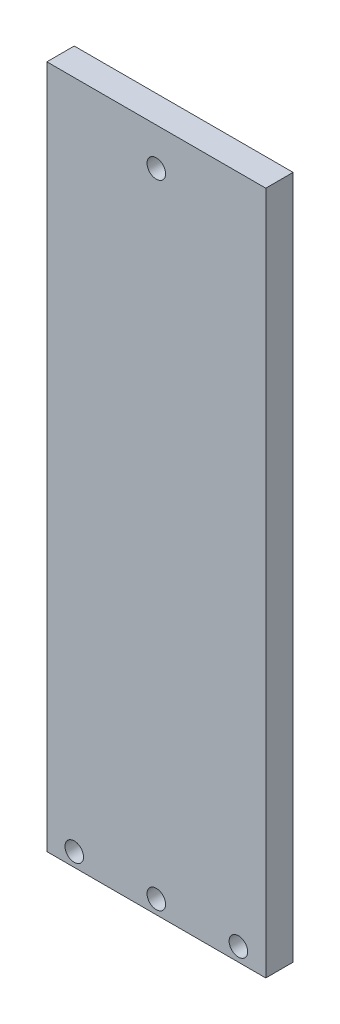
ISO-10303-21;
HEADER;
FILE_DESCRIPTION(('STEP AP214'),'2;1');
FILE_NAME('part.step','',(''),(''),'','','');
FILE_SCHEMA(('AUTOMOTIVE_DESIGN { 1 0 10303 214 1 1 1 1 }'));
ENDSEC;
DATA;
#1=APPLICATION_CONTEXT('core data for automotive mechanical design processes');
#2=APPLICATION_PROTOCOL_DEFINITION('international standard','automotive_design',2000,#1);
#3=PRODUCT_CONTEXT('',#1,'mechanical');
#4=PRODUCT('Part','Part','',(#3));
#5=PRODUCT_RELATED_PRODUCT_CATEGORY('part','',(#4));
#6=PRODUCT_DEFINITION_FORMATION('','',#4);
#7=PRODUCT_DEFINITION_CONTEXT('part definition',#1,'design');
#8=PRODUCT_DEFINITION('design','',#6,#7);
#9=PRODUCT_DEFINITION_SHAPE('','',#8);
#10=(LENGTH_UNIT() NAMED_UNIT(*) SI_UNIT(.MILLI.,.METRE.));
#11=(NAMED_UNIT(*) PLANE_ANGLE_UNIT() SI_UNIT($,.RADIAN.));
#12=(NAMED_UNIT(*) SI_UNIT($,.STERADIAN.) SOLID_ANGLE_UNIT());
#13=UNCERTAINTY_MEASURE_WITH_UNIT(LENGTH_MEASURE(1.E-05),#10,'distance_accuracy_value','');
#14=(GEOMETRIC_REPRESENTATION_CONTEXT(3) GLOBAL_UNCERTAINTY_ASSIGNED_CONTEXT((#13)) GLOBAL_UNIT_ASSIGNED_CONTEXT((#10,
#11,#12)) REPRESENTATION_CONTEXT('',''));
#15=CARTESIAN_POINT('',(0.,0.,0.));
#16=DIRECTION('',(0.,0.,1.));
#17=DIRECTION('',(1.,0.,0.));
#18=AXIS2_PLACEMENT_3D('',#15,#16,#17);
#19=CARTESIAN_POINT('',(0.,0.,3.175));
#20=DIRECTION('',(0.,0.,-1.));
#21=DIRECTION('',(-1.,0.,0.));
#22=AXIS2_PLACEMENT_3D('',#19,#20,#21);
#23=PLANE('',#22);
#24=DIRECTION('',(0.,1.,0.));
#25=VECTOR('',#24,1.);
#26=CARTESIAN_POINT('',(25.4,-76.2,3.175));
#27=LINE('',#26,#25);
#28=CARTESIAN_POINT('',(25.4,-82.55,3.175));
#29=VERTEX_POINT('',#28);
#30=CARTESIAN_POINT('',(25.4,76.2,3.175));
#31=VERTEX_POINT('',#30);
#32=EDGE_CURVE('E51',#29,#31,#27,.T.);
#33=ORIENTED_EDGE('',*,*,#32,.T.);
#34=DIRECTION('',(-1.,0.,0.));
#35=VECTOR('',#34,1.);
#36=CARTESIAN_POINT('',(-25.4,76.2,3.175));
#37=LINE('',#36,#35);
#38=CARTESIAN_POINT('',(-25.4,76.2,3.175));
#39=VERTEX_POINT('',#38);
#40=EDGE_CURVE('E81',#31,#39,#37,.T.);
#41=ORIENTED_EDGE('',*,*,#40,.T.);
#42=DIRECTION('',(0.,-1.,0.));
#43=VECTOR('',#42,1.);
#44=CARTESIAN_POINT('',(-25.4,-76.2,3.175));
#45=LINE('',#44,#43);
#46=CARTESIAN_POINT('',(-25.4,-82.55,3.175));
#47=VERTEX_POINT('',#46);
#48=EDGE_CURVE('E85',#39,#47,#45,.T.);
#49=ORIENTED_EDGE('',*,*,#48,.T.);
#50=DIRECTION('',(1.,0.,0.));
#51=VECTOR('',#50,1.);
#52=CARTESIAN_POINT('',(-25.4,-82.55,3.175));
#53=LINE('',#52,#51);
#54=EDGE_CURVE('E93',#47,#29,#53,.T.);
#55=ORIENTED_EDGE('',*,*,#54,.T.);
#56=EDGE_LOOP('',(#33,#41,#49,#55));
#57=FACE_BOUND('',#56,.T.);
#58=CARTESIAN_POINT('',(0.,67.4497,3.175));
#59=DIRECTION('',(0.,0.,1.));
#60=DIRECTION('',(1.,0.,0.));
#61=AXIS2_PLACEMENT_3D('',#58,#59,#60);
#62=CIRCLE('',#61,2.15265);
#63=CARTESIAN_POINT('',(2.15265,67.4497,3.175));
#64=VERTEX_POINT('',#63);
#65=EDGE_CURVE('E100',#64,#64,#62,.T.);
#66=ORIENTED_EDGE('',*,*,#65,.F.);
#67=EDGE_LOOP('',(#66));
#68=FACE_BOUND('',#67,.T.);
#69=CARTESIAN_POINT('',(-19.05,-79.375,3.175));
#70=DIRECTION('',(0.,0.,1.));
#71=DIRECTION('',(1.,0.,0.));
#72=AXIS2_PLACEMENT_3D('',#69,#70,#71);
#73=CIRCLE('',#72,2.15265);
#74=CARTESIAN_POINT('',(-16.89735,-79.375,3.175));
#75=VERTEX_POINT('',#74);
#76=EDGE_CURVE('E161',#75,#75,#73,.T.);
#77=ORIENTED_EDGE('',*,*,#76,.F.);
#78=EDGE_LOOP('',(#77));
#79=FACE_BOUND('',#78,.T.);
#80=CARTESIAN_POINT('',(0.,-79.375,3.175));
#81=DIRECTION('',(0.,0.,1.));
#82=DIRECTION('',(1.,0.,0.));
#83=AXIS2_PLACEMENT_3D('',#80,#81,#82);
#84=CIRCLE('',#83,2.15265);
#85=CARTESIAN_POINT('',(2.15265,-79.375,3.175));
#86=VERTEX_POINT('',#85);
#87=EDGE_CURVE('E155',#86,#86,#84,.T.);
#88=ORIENTED_EDGE('',*,*,#87,.F.);
#89=EDGE_LOOP('',(#88));
#90=FACE_BOUND('',#89,.T.);
#91=CARTESIAN_POINT('',(19.05,-79.375,3.175));
#92=DIRECTION('',(0.,0.,1.));
#93=DIRECTION('',(1.,0.,0.));
#94=AXIS2_PLACEMENT_3D('',#91,#92,#93);
#95=CIRCLE('',#94,2.15265);
#96=CARTESIAN_POINT('',(21.20265,-79.375,3.175));
#97=VERTEX_POINT('',#96);
#98=EDGE_CURVE('E146',#97,#97,#95,.T.);
#99=ORIENTED_EDGE('',*,*,#98,.F.);
#100=EDGE_LOOP('',(#99));
#101=FACE_BOUND('',#100,.T.);
#102=ADVANCED_FACE('F34',(#57,#68,#79,#90,#101),#23,.F.);
#103=CARTESIAN_POINT('',(0.,0.,-3.175));
#104=DIRECTION('',(0.,0.,-1.));
#105=DIRECTION('',(-1.,0.,0.));
#106=AXIS2_PLACEMENT_3D('',#103,#104,#105);
#107=PLANE('',#106);
#108=CARTESIAN_POINT('',(0.,-79.375,-3.175));
#109=DIRECTION('',(0.,0.,1.));
#110=DIRECTION('',(1.,0.,0.));
#111=AXIS2_PLACEMENT_3D('',#108,#109,#110);
#112=CIRCLE('',#111,2.15265);
#113=CARTESIAN_POINT('',(2.15265,-79.375,-3.175));
#114=VERTEX_POINT('',#113);
#115=EDGE_CURVE('E152',#114,#114,#112,.T.);
#116=ORIENTED_EDGE('',*,*,#115,.T.);
#117=EDGE_LOOP('',(#116));
#118=FACE_BOUND('',#117,.T.);
#119=CARTESIAN_POINT('',(0.,67.4497,-3.175));
#120=DIRECTION('',(0.,0.,1.));
#121=DIRECTION('',(1.,0.,0.));
#122=AXIS2_PLACEMENT_3D('',#119,#120,#121);
#123=CIRCLE('',#122,2.15265);
#124=CARTESIAN_POINT('',(2.15265,67.4497,-3.175));
#125=VERTEX_POINT('',#124);
#126=EDGE_CURVE('E164',#125,#125,#123,.T.);
#127=ORIENTED_EDGE('',*,*,#126,.T.);
#128=EDGE_LOOP('',(#127));
#129=FACE_BOUND('',#128,.T.);
#130=DIRECTION('',(-1.,0.,0.));
#131=VECTOR('',#130,1.);
#132=CARTESIAN_POINT('',(-25.4,76.2,-3.175));
#133=LINE('',#132,#131);
#134=CARTESIAN_POINT('',(25.4,76.2,-3.175));
#135=VERTEX_POINT('',#134);
#136=CARTESIAN_POINT('',(-25.4,76.2,-3.175));
#137=VERTEX_POINT('',#136);
#138=EDGE_CURVE('E89',#135,#137,#133,.T.);
#139=ORIENTED_EDGE('',*,*,#138,.F.);
#140=DIRECTION('',(0.,1.,0.));
#141=VECTOR('',#140,1.);
#142=CARTESIAN_POINT('',(25.4,-82.55,-3.175));
#143=LINE('',#142,#141);
#144=CARTESIAN_POINT('',(25.4,-82.55,-3.175));
#145=VERTEX_POINT('',#144);
#146=EDGE_CURVE('E103',#145,#135,#143,.T.);
#147=ORIENTED_EDGE('',*,*,#146,.F.);
#148=DIRECTION('',(1.,0.,0.));
#149=VECTOR('',#148,1.);
#150=CARTESIAN_POINT('',(-25.4,-82.55,-3.175));
#151=LINE('',#150,#149);
#152=CARTESIAN_POINT('',(-25.4,-82.55,-3.175));
#153=VERTEX_POINT('',#152);
#154=EDGE_CURVE('E75',#153,#145,#151,.T.);
#155=ORIENTED_EDGE('',*,*,#154,.F.);
#156=DIRECTION('',(0.,-1.,0.));
#157=VECTOR('',#156,1.);
#158=CARTESIAN_POINT('',(-25.4,-76.2,-3.175));
#159=LINE('',#158,#157);
#160=EDGE_CURVE('E68',#137,#153,#159,.T.);
#161=ORIENTED_EDGE('',*,*,#160,.F.);
#162=EDGE_LOOP('',(#139,#147,#155,#161));
#163=FACE_BOUND('',#162,.T.);
#164=CARTESIAN_POINT('',(-19.05,-79.375,-3.175));
#165=DIRECTION('',(0.,0.,1.));
#166=DIRECTION('',(1.,0.,0.));
#167=AXIS2_PLACEMENT_3D('',#164,#165,#166);
#168=CIRCLE('',#167,2.15265);
#169=CARTESIAN_POINT('',(-16.89735,-79.375,-3.175));
#170=VERTEX_POINT('',#169);
#171=EDGE_CURVE('E158',#170,#170,#168,.T.);
#172=ORIENTED_EDGE('',*,*,#171,.T.);
#173=EDGE_LOOP('',(#172));
#174=FACE_BOUND('',#173,.T.);
#175=CARTESIAN_POINT('',(19.05,-79.375,-3.175));
#176=DIRECTION('',(0.,0.,1.));
#177=DIRECTION('',(1.,0.,0.));
#178=AXIS2_PLACEMENT_3D('',#175,#176,#177);
#179=CIRCLE('',#178,2.15265);
#180=CARTESIAN_POINT('',(21.20265,-79.375,-3.175));
#181=VERTEX_POINT('',#180);
#182=EDGE_CURVE('E149',#181,#181,#179,.T.);
#183=ORIENTED_EDGE('',*,*,#182,.T.);
#184=EDGE_LOOP('',(#183));
#185=FACE_BOUND('',#184,.T.);
#186=ADVANCED_FACE('F109',(#118,#129,#163,#174,#185),#107,.T.);
#187=CARTESIAN_POINT('',(-25.4,76.2,3.175));
#188=DIRECTION('',(0.,-1.,0.));
#189=DIRECTION('',(0.,0.,-1.));
#190=AXIS2_PLACEMENT_3D('',#187,#188,#189);
#191=PLANE('',#190);
#192=ORIENTED_EDGE('',*,*,#138,.T.);
#193=DIRECTION('',(0.,0.,-1.));
#194=VECTOR('',#193,1.);
#195=CARTESIAN_POINT('',(-25.4,76.2,3.175));
#196=LINE('',#195,#194);
#197=EDGE_CURVE('E43',#39,#137,#196,.T.);
#198=ORIENTED_EDGE('',*,*,#197,.F.);
#199=ORIENTED_EDGE('',*,*,#40,.F.);
#200=DIRECTION('',(0.,0.,-1.));
#201=VECTOR('',#200,1.);
#202=CARTESIAN_POINT('',(25.4,76.2,3.175));
#203=LINE('',#202,#201);
#204=EDGE_CURVE('E11',#31,#135,#203,.T.);
#205=ORIENTED_EDGE('',*,*,#204,.T.);
#206=EDGE_LOOP('',(#192,#198,#199,#205));
#207=FACE_BOUND('',#206,.T.);
#208=ADVANCED_FACE('F36',(#207),#191,.F.);
#209=CARTESIAN_POINT('',(-25.4,-76.2,3.175));
#210=DIRECTION('',(1.,0.,0.));
#211=DIRECTION('',(0.,0.,-1.));
#212=AXIS2_PLACEMENT_3D('',#209,#210,#211);
#213=PLANE('',#212);
#214=ORIENTED_EDGE('',*,*,#160,.T.);
#215=DIRECTION('',(0.,0.,-1.));
#216=VECTOR('',#215,1.);
#217=CARTESIAN_POINT('',(-25.4,-82.55,3.175));
#218=LINE('',#217,#216);
#219=EDGE_CURVE('E90',#47,#153,#218,.T.);
#220=ORIENTED_EDGE('',*,*,#219,.F.);
#221=ORIENTED_EDGE('',*,*,#48,.F.);
#222=ORIENTED_EDGE('',*,*,#197,.T.);
#223=EDGE_LOOP('',(#214,#220,#221,#222));
#224=FACE_BOUND('',#223,.T.);
#225=ADVANCED_FACE('F91',(#224),#213,.F.);
#226=CARTESIAN_POINT('',(-25.4,-82.55,3.175));
#227=DIRECTION('',(0.,1.,0.));
#228=DIRECTION('',(0.,0.,1.));
#229=AXIS2_PLACEMENT_3D('',#226,#227,#228);
#230=PLANE('',#229);
#231=ORIENTED_EDGE('',*,*,#154,.T.);
#232=DIRECTION('',(0.,0.,-1.));
#233=VECTOR('',#232,1.);
#234=CARTESIAN_POINT('',(25.4,-82.55,3.175));
#235=LINE('',#234,#233);
#236=EDGE_CURVE('E95',#29,#145,#235,.T.);
#237=ORIENTED_EDGE('',*,*,#236,.F.);
#238=ORIENTED_EDGE('',*,*,#54,.F.);
#239=ORIENTED_EDGE('',*,*,#219,.T.);
#240=EDGE_LOOP('',(#231,#237,#238,#239));
#241=FACE_BOUND('',#240,.T.);
#242=ADVANCED_FACE('F106',(#241),#230,.F.);
#243=CARTESIAN_POINT('',(25.4,-82.55,3.175));
#244=DIRECTION('',(-1.,0.,0.));
#245=DIRECTION('',(0.,0.,1.));
#246=AXIS2_PLACEMENT_3D('',#243,#244,#245);
#247=PLANE('',#246);
#248=ORIENTED_EDGE('',*,*,#146,.T.);
#249=ORIENTED_EDGE('',*,*,#204,.F.);
#250=ORIENTED_EDGE('',*,*,#32,.F.);
#251=ORIENTED_EDGE('',*,*,#236,.T.);
#252=EDGE_LOOP('',(#248,#249,#250,#251));
#253=FACE_BOUND('',#252,.T.);
#254=ADVANCED_FACE('F111',(#253),#247,.F.);
#255=CARTESIAN_POINT('',(0.,67.4497,3.175));
#256=DIRECTION('',(0.,0.,-1.));
#257=DIRECTION('',(-1.,0.,0.));
#258=AXIS2_PLACEMENT_3D('',#255,#256,#257);
#259=CYLINDRICAL_SURFACE('',#258,2.15265);
#260=ORIENTED_EDGE('',*,*,#65,.T.);
#261=EDGE_LOOP('',(#260));
#262=FACE_BOUND('',#261,.T.);
#263=ORIENTED_EDGE('',*,*,#126,.F.);
#264=EDGE_LOOP('',(#263));
#265=FACE_BOUND('',#264,.T.);
#266=ADVANCED_FACE('F113',(#262,#265),#259,.F.);
#267=CARTESIAN_POINT('',(-19.05,-79.375,3.175));
#268=DIRECTION('',(0.,0.,-1.));
#269=DIRECTION('',(-1.,0.,0.));
#270=AXIS2_PLACEMENT_3D('',#267,#268,#269);
#271=CYLINDRICAL_SURFACE('',#270,2.15265);
#272=ORIENTED_EDGE('',*,*,#76,.T.);
#273=EDGE_LOOP('',(#272));
#274=FACE_BOUND('',#273,.T.);
#275=ORIENTED_EDGE('',*,*,#171,.F.);
#276=EDGE_LOOP('',(#275));
#277=FACE_BOUND('',#276,.T.);
#278=ADVANCED_FACE('F119',(#274,#277),#271,.F.);
#279=CARTESIAN_POINT('',(0.,-79.375,3.175));
#280=DIRECTION('',(0.,0.,-1.));
#281=DIRECTION('',(-1.,0.,0.));
#282=AXIS2_PLACEMENT_3D('',#279,#280,#281);
#283=CYLINDRICAL_SURFACE('',#282,2.15265);
#284=ORIENTED_EDGE('',*,*,#87,.T.);
#285=EDGE_LOOP('',(#284));
#286=FACE_BOUND('',#285,.T.);
#287=ORIENTED_EDGE('',*,*,#115,.F.);
#288=EDGE_LOOP('',(#287));
#289=FACE_BOUND('',#288,.T.);
#290=ADVANCED_FACE('F133',(#286,#289),#283,.F.);
#291=CARTESIAN_POINT('',(19.05,-79.375,3.175));
#292=DIRECTION('',(0.,0.,-1.));
#293=DIRECTION('',(-1.,0.,0.));
#294=AXIS2_PLACEMENT_3D('',#291,#292,#293);
#295=CYLINDRICAL_SURFACE('',#294,2.15265);
#296=ORIENTED_EDGE('',*,*,#98,.T.);
#297=EDGE_LOOP('',(#296));
#298=FACE_BOUND('',#297,.T.);
#299=ORIENTED_EDGE('',*,*,#182,.F.);
#300=EDGE_LOOP('',(#299));
#301=FACE_BOUND('',#300,.T.);
#302=ADVANCED_FACE('F137',(#298,#301),#295,.F.);
#303=CLOSED_SHELL('',(#102,#186,#208,#225,#242,#254,#266,#278,#290,#302));
#304=MANIFOLD_SOLID_BREP('B2',#303);
#305=ADVANCED_BREP_SHAPE_REPRESENTATION('',(#18,#304),#14);
#306=SHAPE_DEFINITION_REPRESENTATION(#9,#305);
ENDSEC;
END-ISO-10303-21;
